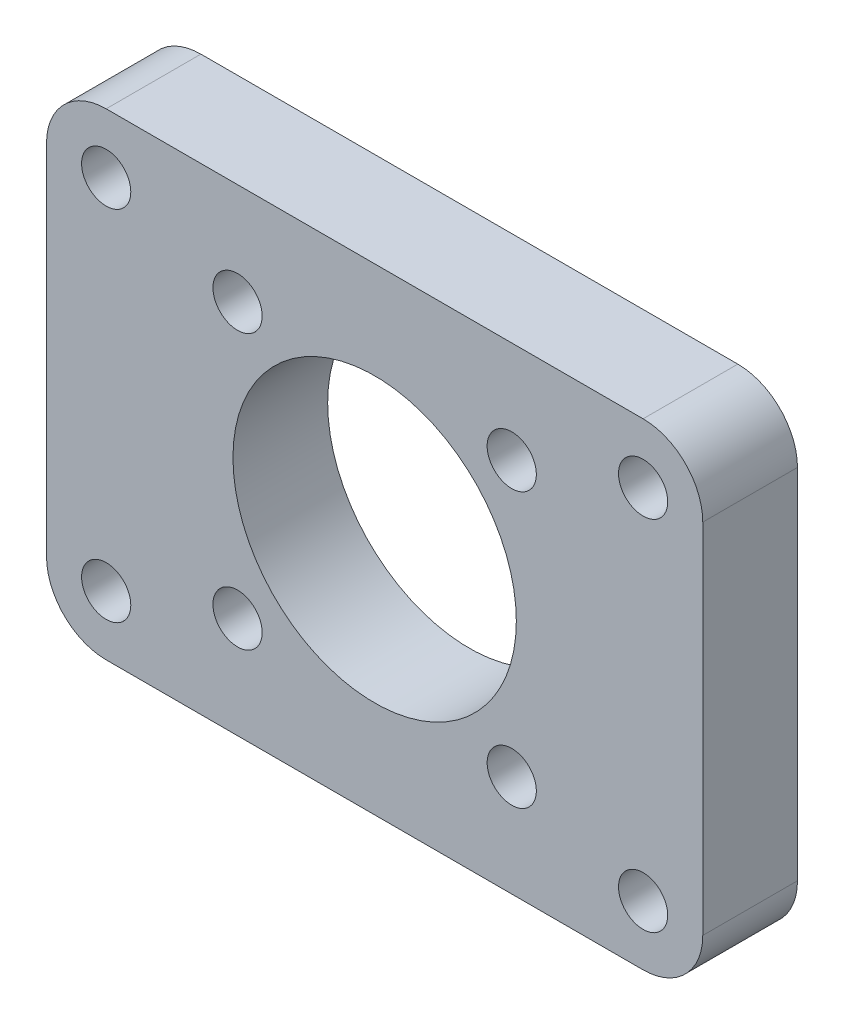
ISO-10303-21;
HEADER;
FILE_DESCRIPTION(('STEP AP214'),'2;1');
FILE_NAME('part.step','',(''),(''),'','','');
FILE_SCHEMA(('AUTOMOTIVE_DESIGN { 1 0 10303 214 1 1 1 1 }'));
ENDSEC;
DATA;
#1=APPLICATION_CONTEXT('core data for automotive mechanical design processes');
#2=APPLICATION_PROTOCOL_DEFINITION('international standard','automotive_design',2000,#1);
#3=PRODUCT_CONTEXT('',#1,'mechanical');
#4=PRODUCT('Part','Part','',(#3));
#5=PRODUCT_RELATED_PRODUCT_CATEGORY('part','',(#4));
#6=PRODUCT_DEFINITION_FORMATION('','',#4);
#7=PRODUCT_DEFINITION_CONTEXT('part definition',#1,'design');
#8=PRODUCT_DEFINITION('design','',#6,#7);
#9=PRODUCT_DEFINITION_SHAPE('','',#8);
#10=(LENGTH_UNIT() NAMED_UNIT(*) SI_UNIT(.MILLI.,.METRE.));
#11=(NAMED_UNIT(*) PLANE_ANGLE_UNIT() SI_UNIT($,.RADIAN.));
#12=(NAMED_UNIT(*) SI_UNIT($,.STERADIAN.) SOLID_ANGLE_UNIT());
#13=UNCERTAINTY_MEASURE_WITH_UNIT(LENGTH_MEASURE(1.E-05),#10,'distance_accuracy_value','');
#14=(GEOMETRIC_REPRESENTATION_CONTEXT(3) GLOBAL_UNCERTAINTY_ASSIGNED_CONTEXT((#13)) GLOBAL_UNIT_ASSIGNED_CONTEXT((#10,
#11,#12)) REPRESENTATION_CONTEXT('',''));
#15=CARTESIAN_POINT('',(0.,0.,0.));
#16=DIRECTION('',(0.,0.,1.));
#17=DIRECTION('',(1.,0.,0.));
#18=AXIS2_PLACEMENT_3D('',#15,#16,#17);
#19=CARTESIAN_POINT('',(0.,0.,6.35));
#20=DIRECTION('',(0.,0.,1.));
#21=DIRECTION('',(1.,0.,0.));
#22=AXIS2_PLACEMENT_3D('',#19,#20,#21);
#23=PLANE('',#22);
#24=CARTESIAN_POINT('',(18.,-12.,6.35));
#25=DIRECTION('',(0.,0.,1.));
#26=DIRECTION('',(1.,0.,0.));
#27=AXIS2_PLACEMENT_3D('',#24,#25,#26);
#28=CIRCLE('',#27,1.65);
#29=CARTESIAN_POINT('',(19.65,-12.,6.35));
#30=VERTEX_POINT('',#29);
#31=EDGE_CURVE('E227',#30,#30,#28,.T.);
#32=ORIENTED_EDGE('',*,*,#31,.F.);
#33=EDGE_LOOP('',(#32));
#34=FACE_BOUND('',#33,.T.);
#35=CARTESIAN_POINT('',(18.,12.,6.35));
#36=DIRECTION('',(0.,0.,1.));
#37=DIRECTION('',(1.,0.,0.));
#38=AXIS2_PLACEMENT_3D('',#35,#36,#37);
#39=CIRCLE('',#38,1.65);
#40=CARTESIAN_POINT('',(19.65,12.,6.35));
#41=VERTEX_POINT('',#40);
#42=EDGE_CURVE('E221',#41,#41,#39,.T.);
#43=ORIENTED_EDGE('',*,*,#42,.F.);
#44=EDGE_LOOP('',(#43));
#45=FACE_BOUND('',#44,.T.);
#46=CARTESIAN_POINT('',(-18.,-12.,6.35));
#47=DIRECTION('',(0.,0.,1.));
#48=DIRECTION('',(1.,0.,0.));
#49=AXIS2_PLACEMENT_3D('',#46,#47,#48);
#50=CIRCLE('',#49,1.65);
#51=CARTESIAN_POINT('',(-16.35,-12.,6.35));
#52=VERTEX_POINT('',#51);
#53=EDGE_CURVE('E215',#52,#52,#50,.T.);
#54=ORIENTED_EDGE('',*,*,#53,.F.);
#55=EDGE_LOOP('',(#54));
#56=FACE_BOUND('',#55,.T.);
#57=CARTESIAN_POINT('',(-18.,12.,6.35));
#58=DIRECTION('',(0.,0.,1.));
#59=DIRECTION('',(1.,0.,0.));
#60=AXIS2_PLACEMENT_3D('',#57,#58,#59);
#61=CIRCLE('',#60,1.65);
#62=CARTESIAN_POINT('',(-16.35,12.,6.35));
#63=VERTEX_POINT('',#62);
#64=EDGE_CURVE('E209',#63,#63,#61,.T.);
#65=ORIENTED_EDGE('',*,*,#64,.F.);
#66=EDGE_LOOP('',(#65));
#67=FACE_BOUND('',#66,.T.);
#68=CARTESIAN_POINT('',(9.19238815542512,-9.19238815542511,6.35));
#69=DIRECTION('',(0.,0.,1.));
#70=DIRECTION('',(1.,0.,0.));
#71=AXIS2_PLACEMENT_3D('',#68,#69,#70);
#72=CIRCLE('',#71,1.65);
#73=CARTESIAN_POINT('',(10.8423881554251,-9.19238815542511,6.35));
#74=VERTEX_POINT('',#73);
#75=EDGE_CURVE('E194',#74,#74,#72,.T.);
#76=ORIENTED_EDGE('',*,*,#75,.F.);
#77=EDGE_LOOP('',(#76));
#78=FACE_BOUND('',#77,.T.);
#79=CARTESIAN_POINT('',(-9.19238815542512,9.19238815542512,6.35));
#80=DIRECTION('',(0.,0.,1.));
#81=DIRECTION('',(1.,0.,0.));
#82=AXIS2_PLACEMENT_3D('',#79,#80,#81);
#83=CIRCLE('',#82,1.65);
#84=CARTESIAN_POINT('',(-7.54238815542512,9.19238815542512,6.35));
#85=VERTEX_POINT('',#84);
#86=EDGE_CURVE('E183',#85,#85,#83,.T.);
#87=ORIENTED_EDGE('',*,*,#86,.F.);
#88=EDGE_LOOP('',(#87));
#89=FACE_BOUND('',#88,.T.);
#90=DIRECTION('',(1.,0.,0.));
#91=VECTOR('',#90,1.);
#92=CARTESIAN_POINT('',(-22.,-16.,6.35));
#93=LINE('',#92,#91);
#94=CARTESIAN_POINT('',(-18.,-16.,6.35));
#95=VERTEX_POINT('',#94);
#96=CARTESIAN_POINT('',(18.,-16.,6.35));
#97=VERTEX_POINT('',#96);
#98=EDGE_CURVE('E168',#95,#97,#93,.T.);
#99=ORIENTED_EDGE('',*,*,#98,.T.);
#100=CARTESIAN_POINT('',(18.,-12.,6.35));
#101=DIRECTION('',(0.,0.,1.));
#102=DIRECTION('',(1.,0.,0.));
#103=AXIS2_PLACEMENT_3D('',#100,#101,#102);
#104=CIRCLE('',#103,4.);
#105=CARTESIAN_POINT('',(22.,-12.,6.35));
#106=VERTEX_POINT('',#105);
#107=EDGE_CURVE('E148',#97,#106,#104,.T.);
#108=ORIENTED_EDGE('',*,*,#107,.T.);
#109=DIRECTION('',(0.,1.,0.));
#110=VECTOR('',#109,1.);
#111=CARTESIAN_POINT('',(22.,16.,6.35));
#112=LINE('',#111,#110);
#113=CARTESIAN_POINT('',(22.,12.,6.35));
#114=VERTEX_POINT('',#113);
#115=EDGE_CURVE('E118',#106,#114,#112,.T.);
#116=ORIENTED_EDGE('',*,*,#115,.T.);
#117=CARTESIAN_POINT('',(18.,12.,6.35));
#118=DIRECTION('',(0.,0.,1.));
#119=DIRECTION('',(1.,0.,0.));
#120=AXIS2_PLACEMENT_3D('',#117,#118,#119);
#121=CIRCLE('',#120,4.);
#122=CARTESIAN_POINT('',(18.,16.,6.35));
#123=VERTEX_POINT('',#122);
#124=EDGE_CURVE('E54',#114,#123,#121,.T.);
#125=ORIENTED_EDGE('',*,*,#124,.T.);
#126=DIRECTION('',(-1.,0.,0.));
#127=VECTOR('',#126,1.);
#128=CARTESIAN_POINT('',(-22.,16.,6.35));
#129=LINE('',#128,#127);
#130=CARTESIAN_POINT('',(-18.,16.,6.35));
#131=VERTEX_POINT('',#130);
#132=EDGE_CURVE('E135',#123,#131,#129,.T.);
#133=ORIENTED_EDGE('',*,*,#132,.T.);
#134=CARTESIAN_POINT('',(-18.,12.,6.35));
#135=DIRECTION('',(0.,0.,1.));
#136=DIRECTION('',(1.,0.,0.));
#137=AXIS2_PLACEMENT_3D('',#134,#135,#136);
#138=CIRCLE('',#137,4.);
#139=CARTESIAN_POINT('',(-22.,12.,6.35));
#140=VERTEX_POINT('',#139);
#141=EDGE_CURVE('E143',#131,#140,#138,.T.);
#142=ORIENTED_EDGE('',*,*,#141,.T.);
#143=DIRECTION('',(0.,-1.,0.));
#144=VECTOR('',#143,1.);
#145=CARTESIAN_POINT('',(-22.,16.,6.35));
#146=LINE('',#145,#144);
#147=CARTESIAN_POINT('',(-22.,-12.,6.35));
#148=VERTEX_POINT('',#147);
#149=EDGE_CURVE('E129',#140,#148,#146,.T.);
#150=ORIENTED_EDGE('',*,*,#149,.T.);
#151=CARTESIAN_POINT('',(-18.,-12.,6.35));
#152=DIRECTION('',(0.,0.,1.));
#153=DIRECTION('',(1.,0.,0.));
#154=AXIS2_PLACEMENT_3D('',#151,#152,#153);
#155=CIRCLE('',#154,4.);
#156=EDGE_CURVE('E146',#148,#95,#155,.T.);
#157=ORIENTED_EDGE('',*,*,#156,.T.);
#158=EDGE_LOOP('',(#99,#108,#116,#125,#133,#142,#150,#157));
#159=FACE_BOUND('',#158,.T.);
#160=CARTESIAN_POINT('',(0.,0.,6.35));
#161=DIRECTION('',(0.,0.,1.));
#162=DIRECTION('',(1.,0.,0.));
#163=AXIS2_PLACEMENT_3D('',#160,#161,#162);
#164=CIRCLE('',#163,9.5);
#165=CARTESIAN_POINT('',(9.5,0.,6.35));
#166=VERTEX_POINT('',#165);
#167=EDGE_CURVE('E174',#166,#166,#164,.T.);
#168=ORIENTED_EDGE('',*,*,#167,.F.);
#169=EDGE_LOOP('',(#168));
#170=FACE_BOUND('',#169,.T.);
#171=CARTESIAN_POINT('',(9.19238815542512,9.19238815542512,6.35));
#172=DIRECTION('',(0.,0.,1.));
#173=DIRECTION('',(1.,0.,0.));
#174=AXIS2_PLACEMENT_3D('',#171,#172,#173);
#175=CIRCLE('',#174,1.65);
#176=CARTESIAN_POINT('',(10.8423881554251,9.19238815542512,6.35));
#177=VERTEX_POINT('',#176);
#178=EDGE_CURVE('E188',#177,#177,#175,.T.);
#179=ORIENTED_EDGE('',*,*,#178,.F.);
#180=EDGE_LOOP('',(#179));
#181=FACE_BOUND('',#180,.T.);
#182=CARTESIAN_POINT('',(-9.19238815542511,-9.19238815542512,6.35));
#183=DIRECTION('',(0.,0.,1.));
#184=DIRECTION('',(1.,0.,0.));
#185=AXIS2_PLACEMENT_3D('',#182,#183,#184);
#186=CIRCLE('',#185,1.65);
#187=CARTESIAN_POINT('',(-7.54238815542511,-9.19238815542512,6.35));
#188=VERTEX_POINT('',#187);
#189=EDGE_CURVE('E200',#188,#188,#186,.T.);
#190=ORIENTED_EDGE('',*,*,#189,.F.);
#191=EDGE_LOOP('',(#190));
#192=FACE_BOUND('',#191,.T.);
#193=ADVANCED_FACE('F33',(#34,#45,#56,#67,#78,#89,#159,#170,#181,#192),#23,.T.);
#194=CARTESIAN_POINT('',(0.,0.,0.));
#195=DIRECTION('',(0.,0.,1.));
#196=DIRECTION('',(1.,0.,0.));
#197=AXIS2_PLACEMENT_3D('',#194,#195,#196);
#198=PLANE('',#197);
#199=CARTESIAN_POINT('',(18.,-12.,0.));
#200=DIRECTION('',(0.,0.,1.));
#201=DIRECTION('',(1.,0.,0.));
#202=AXIS2_PLACEMENT_3D('',#199,#200,#201);
#203=CIRCLE('',#202,1.65);
#204=CARTESIAN_POINT('',(19.65,-12.,0.));
#205=VERTEX_POINT('',#204);
#206=EDGE_CURVE('E224',#205,#205,#203,.T.);
#207=ORIENTED_EDGE('',*,*,#206,.T.);
#208=EDGE_LOOP('',(#207));
#209=FACE_BOUND('',#208,.T.);
#210=CARTESIAN_POINT('',(18.,12.,0.));
#211=DIRECTION('',(0.,0.,1.));
#212=DIRECTION('',(1.,0.,0.));
#213=AXIS2_PLACEMENT_3D('',#210,#211,#212);
#214=CIRCLE('',#213,1.65);
#215=CARTESIAN_POINT('',(19.65,12.,0.));
#216=VERTEX_POINT('',#215);
#217=EDGE_CURVE('E218',#216,#216,#214,.T.);
#218=ORIENTED_EDGE('',*,*,#217,.T.);
#219=EDGE_LOOP('',(#218));
#220=FACE_BOUND('',#219,.T.);
#221=CARTESIAN_POINT('',(-18.,-12.,0.));
#222=DIRECTION('',(0.,0.,1.));
#223=DIRECTION('',(1.,0.,0.));
#224=AXIS2_PLACEMENT_3D('',#221,#222,#223);
#225=CIRCLE('',#224,1.65);
#226=CARTESIAN_POINT('',(-16.35,-12.,0.));
#227=VERTEX_POINT('',#226);
#228=EDGE_CURVE('E212',#227,#227,#225,.T.);
#229=ORIENTED_EDGE('',*,*,#228,.T.);
#230=EDGE_LOOP('',(#229));
#231=FACE_BOUND('',#230,.T.);
#232=CARTESIAN_POINT('',(-18.,12.,0.));
#233=DIRECTION('',(0.,0.,1.));
#234=DIRECTION('',(1.,0.,0.));
#235=AXIS2_PLACEMENT_3D('',#232,#233,#234);
#236=CIRCLE('',#235,1.65);
#237=CARTESIAN_POINT('',(-16.35,12.,0.));
#238=VERTEX_POINT('',#237);
#239=EDGE_CURVE('E206',#238,#238,#236,.T.);
#240=ORIENTED_EDGE('',*,*,#239,.T.);
#241=EDGE_LOOP('',(#240));
#242=FACE_BOUND('',#241,.T.);
#243=CARTESIAN_POINT('',(9.19238815542512,-9.19238815542511,0.));
#244=DIRECTION('',(0.,0.,1.));
#245=DIRECTION('',(1.,0.,0.));
#246=AXIS2_PLACEMENT_3D('',#243,#244,#245);
#247=CIRCLE('',#246,1.65);
#248=CARTESIAN_POINT('',(10.8423881554251,-9.19238815542511,0.));
#249=VERTEX_POINT('',#248);
#250=EDGE_CURVE('E197',#249,#249,#247,.T.);
#251=ORIENTED_EDGE('',*,*,#250,.T.);
#252=EDGE_LOOP('',(#251));
#253=FACE_BOUND('',#252,.T.);
#254=CARTESIAN_POINT('',(-9.19238815542512,9.19238815542512,0.));
#255=DIRECTION('',(0.,0.,1.));
#256=DIRECTION('',(1.,0.,0.));
#257=AXIS2_PLACEMENT_3D('',#254,#255,#256);
#258=CIRCLE('',#257,1.65);
#259=CARTESIAN_POINT('',(-7.54238815542512,9.19238815542512,0.));
#260=VERTEX_POINT('',#259);
#261=EDGE_CURVE('E185',#260,#260,#258,.T.);
#262=ORIENTED_EDGE('',*,*,#261,.T.);
#263=EDGE_LOOP('',(#262));
#264=FACE_BOUND('',#263,.T.);
#265=DIRECTION('',(0.,1.,0.));
#266=VECTOR('',#265,1.);
#267=CARTESIAN_POINT('',(22.,16.,0.));
#268=LINE('',#267,#266);
#269=CARTESIAN_POINT('',(22.,-12.,0.));
#270=VERTEX_POINT('',#269);
#271=CARTESIAN_POINT('',(22.,12.,0.));
#272=VERTEX_POINT('',#271);
#273=EDGE_CURVE('E116',#270,#272,#268,.T.);
#274=ORIENTED_EDGE('',*,*,#273,.F.);
#275=CARTESIAN_POINT('',(18.,-12.,0.));
#276=DIRECTION('',(0.,0.,1.));
#277=DIRECTION('',(1.,0.,0.));
#278=AXIS2_PLACEMENT_3D('',#275,#276,#277);
#279=CIRCLE('',#278,4.);
#280=CARTESIAN_POINT('',(18.,-16.,0.));
#281=VERTEX_POINT('',#280);
#282=EDGE_CURVE('E99',#270,#281,#279,.F.);
#283=ORIENTED_EDGE('',*,*,#282,.T.);
#284=DIRECTION('',(1.,0.,0.));
#285=VECTOR('',#284,1.);
#286=CARTESIAN_POINT('',(-22.,-16.,0.));
#287=LINE('',#286,#285);
#288=CARTESIAN_POINT('',(-18.,-16.,0.));
#289=VERTEX_POINT('',#288);
#290=EDGE_CURVE('E127',#289,#281,#287,.T.);
#291=ORIENTED_EDGE('',*,*,#290,.F.);
#292=CARTESIAN_POINT('',(-18.,-12.,0.));
#293=DIRECTION('',(0.,0.,1.));
#294=DIRECTION('',(1.,0.,0.));
#295=AXIS2_PLACEMENT_3D('',#292,#293,#294);
#296=CIRCLE('',#295,4.);
#297=CARTESIAN_POINT('',(-22.,-12.,0.));
#298=VERTEX_POINT('',#297);
#299=EDGE_CURVE('E110',#289,#298,#296,.F.);
#300=ORIENTED_EDGE('',*,*,#299,.T.);
#301=DIRECTION('',(0.,-1.,0.));
#302=VECTOR('',#301,1.);
#303=CARTESIAN_POINT('',(-22.,16.,0.));
#304=LINE('',#303,#302);
#305=CARTESIAN_POINT('',(-22.,12.,0.));
#306=VERTEX_POINT('',#305);
#307=EDGE_CURVE('E131',#306,#298,#304,.T.);
#308=ORIENTED_EDGE('',*,*,#307,.F.);
#309=CARTESIAN_POINT('',(-18.,12.,0.));
#310=DIRECTION('',(0.,0.,1.));
#311=DIRECTION('',(1.,0.,0.));
#312=AXIS2_PLACEMENT_3D('',#309,#310,#311);
#313=CIRCLE('',#312,4.);
#314=CARTESIAN_POINT('',(-18.,16.,0.));
#315=VERTEX_POINT('',#314);
#316=EDGE_CURVE('E119',#306,#315,#313,.F.);
#317=ORIENTED_EDGE('',*,*,#316,.T.);
#318=DIRECTION('',(-1.,0.,0.));
#319=VECTOR('',#318,1.);
#320=CARTESIAN_POINT('',(-22.,16.,0.));
#321=LINE('',#320,#319);
#322=CARTESIAN_POINT('',(18.,16.,0.));
#323=VERTEX_POINT('',#322);
#324=EDGE_CURVE('E126',#323,#315,#321,.T.);
#325=ORIENTED_EDGE('',*,*,#324,.F.);
#326=CARTESIAN_POINT('',(18.,12.,0.));
#327=DIRECTION('',(0.,0.,1.));
#328=DIRECTION('',(1.,0.,0.));
#329=AXIS2_PLACEMENT_3D('',#326,#327,#328);
#330=CIRCLE('',#329,4.);
#331=EDGE_CURVE('E125',#323,#272,#330,.F.);
#332=ORIENTED_EDGE('',*,*,#331,.T.);
#333=EDGE_LOOP('',(#274,#283,#291,#300,#308,#317,#325,#332));
#334=FACE_BOUND('',#333,.T.);
#335=CARTESIAN_POINT('',(0.,0.,0.));
#336=DIRECTION('',(0.,0.,1.));
#337=DIRECTION('',(1.,0.,0.));
#338=AXIS2_PLACEMENT_3D('',#335,#336,#337);
#339=CIRCLE('',#338,9.5);
#340=CARTESIAN_POINT('',(9.5,0.,0.));
#341=VERTEX_POINT('',#340);
#342=EDGE_CURVE('E176',#341,#341,#339,.T.);
#343=ORIENTED_EDGE('',*,*,#342,.T.);
#344=EDGE_LOOP('',(#343));
#345=FACE_BOUND('',#344,.T.);
#346=CARTESIAN_POINT('',(9.19238815542512,9.19238815542512,0.));
#347=DIRECTION('',(0.,0.,1.));
#348=DIRECTION('',(1.,0.,0.));
#349=AXIS2_PLACEMENT_3D('',#346,#347,#348);
#350=CIRCLE('',#349,1.65);
#351=CARTESIAN_POINT('',(10.8423881554251,9.19238815542512,0.));
#352=VERTEX_POINT('',#351);
#353=EDGE_CURVE('E191',#352,#352,#350,.T.);
#354=ORIENTED_EDGE('',*,*,#353,.T.);
#355=EDGE_LOOP('',(#354));
#356=FACE_BOUND('',#355,.T.);
#357=CARTESIAN_POINT('',(-9.19238815542511,-9.19238815542512,0.));
#358=DIRECTION('',(0.,0.,1.));
#359=DIRECTION('',(1.,0.,0.));
#360=AXIS2_PLACEMENT_3D('',#357,#358,#359);
#361=CIRCLE('',#360,1.65);
#362=CARTESIAN_POINT('',(-7.54238815542511,-9.19238815542512,0.));
#363=VERTEX_POINT('',#362);
#364=EDGE_CURVE('E203',#363,#363,#361,.T.);
#365=ORIENTED_EDGE('',*,*,#364,.T.);
#366=EDGE_LOOP('',(#365));
#367=FACE_BOUND('',#366,.T.);
#368=ADVANCED_FACE('F122',(#209,#220,#231,#242,#253,#264,#334,#345,#356,#367),#198,.F.);
#369=CARTESIAN_POINT('',(-22.,16.,6.35));
#370=DIRECTION('',(1.,0.,0.));
#371=DIRECTION('',(0.,1.,0.));
#372=AXIS2_PLACEMENT_3D('',#369,#370,#371);
#373=PLANE('',#372);
#374=ORIENTED_EDGE('',*,*,#307,.T.);
#375=DIRECTION('',(0.,0.,-1.));
#376=VECTOR('',#375,1.);
#377=CARTESIAN_POINT('',(-22.,-12.,6.35));
#378=LINE('',#377,#376);
#379=EDGE_CURVE('E153',#298,#148,#378,.F.);
#380=ORIENTED_EDGE('',*,*,#379,.T.);
#381=ORIENTED_EDGE('',*,*,#149,.F.);
#382=DIRECTION('',(0.,0.,-1.));
#383=VECTOR('',#382,1.);
#384=CARTESIAN_POINT('',(-22.,12.,6.35));
#385=LINE('',#384,#383);
#386=EDGE_CURVE('E150',#140,#306,#385,.T.);
#387=ORIENTED_EDGE('',*,*,#386,.T.);
#388=EDGE_LOOP('',(#374,#380,#381,#387));
#389=FACE_BOUND('',#388,.T.);
#390=ADVANCED_FACE('F159',(#389),#373,.F.);
#391=CARTESIAN_POINT('',(-22.,-16.,6.35));
#392=DIRECTION('',(0.,1.,0.));
#393=DIRECTION('',(0.,0.,1.));
#394=AXIS2_PLACEMENT_3D('',#391,#392,#393);
#395=PLANE('',#394);
#396=ORIENTED_EDGE('',*,*,#290,.T.);
#397=DIRECTION('',(0.,0.,-1.));
#398=VECTOR('',#397,1.);
#399=CARTESIAN_POINT('',(18.,-16.,6.35));
#400=LINE('',#399,#398);
#401=EDGE_CURVE('E104',#281,#97,#400,.F.);
#402=ORIENTED_EDGE('',*,*,#401,.T.);
#403=ORIENTED_EDGE('',*,*,#98,.F.);
#404=DIRECTION('',(0.,0.,-1.));
#405=VECTOR('',#404,1.);
#406=CARTESIAN_POINT('',(-18.,-16.,6.35));
#407=LINE('',#406,#405);
#408=EDGE_CURVE('E109',#95,#289,#407,.T.);
#409=ORIENTED_EDGE('',*,*,#408,.T.);
#410=EDGE_LOOP('',(#396,#402,#403,#409));
#411=FACE_BOUND('',#410,.T.);
#412=ADVANCED_FACE('F173',(#411),#395,.F.);
#413=CARTESIAN_POINT('',(22.,16.,6.35));
#414=DIRECTION('',(-1.,0.,0.));
#415=DIRECTION('',(0.,-1.,0.));
#416=AXIS2_PLACEMENT_3D('',#413,#414,#415);
#417=PLANE('',#416);
#418=ORIENTED_EDGE('',*,*,#115,.F.);
#419=DIRECTION('',(0.,0.,-1.));
#420=VECTOR('',#419,1.);
#421=CARTESIAN_POINT('',(22.,-12.,6.35));
#422=LINE('',#421,#420);
#423=EDGE_CURVE('E103',#106,#270,#422,.T.);
#424=ORIENTED_EDGE('',*,*,#423,.T.);
#425=ORIENTED_EDGE('',*,*,#273,.T.);
#426=DIRECTION('',(0.,0.,-1.));
#427=VECTOR('',#426,1.);
#428=CARTESIAN_POINT('',(22.,12.,6.35));
#429=LINE('',#428,#427);
#430=EDGE_CURVE('E120',#272,#114,#429,.F.);
#431=ORIENTED_EDGE('',*,*,#430,.T.);
#432=EDGE_LOOP('',(#418,#424,#425,#431));
#433=FACE_BOUND('',#432,.T.);
#434=ADVANCED_FACE('F115',(#433),#417,.F.);
#435=CARTESIAN_POINT('',(-22.,16.,6.35));
#436=DIRECTION('',(0.,-1.,0.));
#437=DIRECTION('',(1.,0.,0.));
#438=AXIS2_PLACEMENT_3D('',#435,#436,#437);
#439=PLANE('',#438);
#440=ORIENTED_EDGE('',*,*,#132,.F.);
#441=DIRECTION('',(0.,0.,-1.));
#442=VECTOR('',#441,1.);
#443=CARTESIAN_POINT('',(18.,16.,6.35));
#444=LINE('',#443,#442);
#445=EDGE_CURVE('E11',#123,#323,#444,.T.);
#446=ORIENTED_EDGE('',*,*,#445,.T.);
#447=ORIENTED_EDGE('',*,*,#324,.T.);
#448=DIRECTION('',(0.,0.,-1.));
#449=VECTOR('',#448,1.);
#450=CARTESIAN_POINT('',(-18.,16.,6.35));
#451=LINE('',#450,#449);
#452=EDGE_CURVE('E41',#315,#131,#451,.F.);
#453=ORIENTED_EDGE('',*,*,#452,.T.);
#454=EDGE_LOOP('',(#440,#446,#447,#453));
#455=FACE_BOUND('',#454,.T.);
#456=ADVANCED_FACE('F271',(#455),#439,.F.);
#457=CARTESIAN_POINT('',(0.,0.,6.35));
#458=DIRECTION('',(0.,0.,-1.));
#459=DIRECTION('',(-1.,0.,0.));
#460=AXIS2_PLACEMENT_3D('',#457,#458,#459);
#461=CYLINDRICAL_SURFACE('',#460,9.5);
#462=ORIENTED_EDGE('',*,*,#167,.T.);
#463=EDGE_LOOP('',(#462));
#464=FACE_BOUND('',#463,.T.);
#465=ORIENTED_EDGE('',*,*,#342,.F.);
#466=EDGE_LOOP('',(#465));
#467=FACE_BOUND('',#466,.T.);
#468=ADVANCED_FACE('F259',(#464,#467),#461,.F.);
#469=CARTESIAN_POINT('',(-9.19238815542512,9.19238815542512,6.35));
#470=DIRECTION('',(0.,0.,-1.));
#471=DIRECTION('',(-1.,0.,0.));
#472=AXIS2_PLACEMENT_3D('',#469,#470,#471);
#473=CYLINDRICAL_SURFACE('',#472,1.65);
#474=ORIENTED_EDGE('',*,*,#86,.T.);
#475=EDGE_LOOP('',(#474));
#476=FACE_BOUND('',#475,.T.);
#477=ORIENTED_EDGE('',*,*,#261,.F.);
#478=EDGE_LOOP('',(#477));
#479=FACE_BOUND('',#478,.T.);
#480=ADVANCED_FACE('F255',(#476,#479),#473,.F.);
#481=CARTESIAN_POINT('',(9.19238815542512,9.19238815542512,6.35));
#482=DIRECTION('',(0.,0.,-1.));
#483=DIRECTION('',(-1.,0.,0.));
#484=AXIS2_PLACEMENT_3D('',#481,#482,#483);
#485=CYLINDRICAL_SURFACE('',#484,1.65);
#486=ORIENTED_EDGE('',*,*,#178,.T.);
#487=EDGE_LOOP('',(#486));
#488=FACE_BOUND('',#487,.T.);
#489=ORIENTED_EDGE('',*,*,#353,.F.);
#490=EDGE_LOOP('',(#489));
#491=FACE_BOUND('',#490,.T.);
#492=ADVANCED_FACE('F258',(#488,#491),#485,.F.);
#493=CARTESIAN_POINT('',(9.19238815542512,-9.19238815542511,6.35));
#494=DIRECTION('',(0.,0.,-1.));
#495=DIRECTION('',(-1.,0.,0.));
#496=AXIS2_PLACEMENT_3D('',#493,#494,#495);
#497=CYLINDRICAL_SURFACE('',#496,1.65);
#498=ORIENTED_EDGE('',*,*,#75,.T.);
#499=EDGE_LOOP('',(#498));
#500=FACE_BOUND('',#499,.T.);
#501=ORIENTED_EDGE('',*,*,#250,.F.);
#502=EDGE_LOOP('',(#501));
#503=FACE_BOUND('',#502,.T.);
#504=ADVANCED_FACE('F388',(#500,#503),#497,.F.);
#505=CARTESIAN_POINT('',(-9.19238815542511,-9.19238815542512,6.35));
#506=DIRECTION('',(0.,0.,-1.));
#507=DIRECTION('',(-1.,0.,0.));
#508=AXIS2_PLACEMENT_3D('',#505,#506,#507);
#509=CYLINDRICAL_SURFACE('',#508,1.65);
#510=ORIENTED_EDGE('',*,*,#189,.T.);
#511=EDGE_LOOP('',(#510));
#512=FACE_BOUND('',#511,.T.);
#513=ORIENTED_EDGE('',*,*,#364,.F.);
#514=EDGE_LOOP('',(#513));
#515=FACE_BOUND('',#514,.T.);
#516=ADVANCED_FACE('F378',(#512,#515),#509,.F.);
#517=CARTESIAN_POINT('',(-18.,12.,0.));
#518=DIRECTION('',(0.,0.,1.));
#519=DIRECTION('',(1.,0.,0.));
#520=AXIS2_PLACEMENT_3D('',#517,#518,#519);
#521=CYLINDRICAL_SURFACE('',#520,1.65);
#522=ORIENTED_EDGE('',*,*,#239,.F.);
#523=EDGE_LOOP('',(#522));
#524=FACE_BOUND('',#523,.T.);
#525=ORIENTED_EDGE('',*,*,#64,.T.);
#526=EDGE_LOOP('',(#525));
#527=FACE_BOUND('',#526,.T.);
#528=ADVANCED_FACE('F368',(#524,#527),#521,.F.);
#529=CARTESIAN_POINT('',(-18.,-12.,0.));
#530=DIRECTION('',(0.,0.,1.));
#531=DIRECTION('',(1.,0.,0.));
#532=AXIS2_PLACEMENT_3D('',#529,#530,#531);
#533=CYLINDRICAL_SURFACE('',#532,1.65);
#534=ORIENTED_EDGE('',*,*,#228,.F.);
#535=EDGE_LOOP('',(#534));
#536=FACE_BOUND('',#535,.T.);
#537=ORIENTED_EDGE('',*,*,#53,.T.);
#538=EDGE_LOOP('',(#537));
#539=FACE_BOUND('',#538,.T.);
#540=ADVANCED_FACE('F358',(#536,#539),#533,.F.);
#541=CARTESIAN_POINT('',(18.,12.,0.));
#542=DIRECTION('',(0.,0.,1.));
#543=DIRECTION('',(1.,0.,0.));
#544=AXIS2_PLACEMENT_3D('',#541,#542,#543);
#545=CYLINDRICAL_SURFACE('',#544,1.65);
#546=ORIENTED_EDGE('',*,*,#217,.F.);
#547=EDGE_LOOP('',(#546));
#548=FACE_BOUND('',#547,.T.);
#549=ORIENTED_EDGE('',*,*,#42,.T.);
#550=EDGE_LOOP('',(#549));
#551=FACE_BOUND('',#550,.T.);
#552=ADVANCED_FACE('F238',(#548,#551),#545,.F.);
#553=CARTESIAN_POINT('',(18.,-12.,0.));
#554=DIRECTION('',(0.,0.,1.));
#555=DIRECTION('',(1.,0.,0.));
#556=AXIS2_PLACEMENT_3D('',#553,#554,#555);
#557=CYLINDRICAL_SURFACE('',#556,1.65);
#558=ORIENTED_EDGE('',*,*,#206,.F.);
#559=EDGE_LOOP('',(#558));
#560=FACE_BOUND('',#559,.T.);
#561=ORIENTED_EDGE('',*,*,#31,.T.);
#562=EDGE_LOOP('',(#561));
#563=FACE_BOUND('',#562,.T.);
#564=ADVANCED_FACE('F235',(#560,#563),#557,.F.);
#565=CARTESIAN_POINT('',(18.,-12.,6.35));
#566=DIRECTION('',(0.,0.,-1.));
#567=DIRECTION('',(-1.,0.,0.));
#568=AXIS2_PLACEMENT_3D('',#565,#566,#567);
#569=CYLINDRICAL_SURFACE('',#568,4.);
#570=ORIENTED_EDGE('',*,*,#107,.F.);
#571=ORIENTED_EDGE('',*,*,#401,.F.);
#572=ORIENTED_EDGE('',*,*,#282,.F.);
#573=ORIENTED_EDGE('',*,*,#423,.F.);
#574=EDGE_LOOP('',(#570,#571,#572,#573));
#575=FACE_BOUND('',#574,.T.);
#576=ADVANCED_FACE('F102',(#575),#569,.T.);
#577=CARTESIAN_POINT('',(-18.,-12.,6.35));
#578=DIRECTION('',(0.,0.,-1.));
#579=DIRECTION('',(-1.,0.,0.));
#580=AXIS2_PLACEMENT_3D('',#577,#578,#579);
#581=CYLINDRICAL_SURFACE('',#580,4.);
#582=ORIENTED_EDGE('',*,*,#156,.F.);
#583=ORIENTED_EDGE('',*,*,#379,.F.);
#584=ORIENTED_EDGE('',*,*,#299,.F.);
#585=ORIENTED_EDGE('',*,*,#408,.F.);
#586=EDGE_LOOP('',(#582,#583,#584,#585));
#587=FACE_BOUND('',#586,.T.);
#588=ADVANCED_FACE('F171',(#587),#581,.T.);
#589=CARTESIAN_POINT('',(18.,12.,6.35));
#590=DIRECTION('',(0.,0.,-1.));
#591=DIRECTION('',(-1.,0.,0.));
#592=AXIS2_PLACEMENT_3D('',#589,#590,#591);
#593=CYLINDRICAL_SURFACE('',#592,4.);
#594=ORIENTED_EDGE('',*,*,#124,.F.);
#595=ORIENTED_EDGE('',*,*,#430,.F.);
#596=ORIENTED_EDGE('',*,*,#331,.F.);
#597=ORIENTED_EDGE('',*,*,#445,.F.);
#598=EDGE_LOOP('',(#594,#595,#596,#597));
#599=FACE_BOUND('',#598,.T.);
#600=ADVANCED_FACE('F281',(#599),#593,.T.);
#601=CARTESIAN_POINT('',(-18.,12.,6.35));
#602=DIRECTION('',(0.,0.,-1.));
#603=DIRECTION('',(-1.,0.,0.));
#604=AXIS2_PLACEMENT_3D('',#601,#602,#603);
#605=CYLINDRICAL_SURFACE('',#604,4.);
#606=ORIENTED_EDGE('',*,*,#141,.F.);
#607=ORIENTED_EDGE('',*,*,#452,.F.);
#608=ORIENTED_EDGE('',*,*,#316,.F.);
#609=ORIENTED_EDGE('',*,*,#386,.F.);
#610=EDGE_LOOP('',(#606,#607,#608,#609));
#611=FACE_BOUND('',#610,.T.);
#612=ADVANCED_FACE('F35',(#611),#605,.T.);
#613=CLOSED_SHELL('',(#193,#368,#390,#412,#434,#456,#468,#480,#492,#504,#516,#528,#540,#552,
#564,#576,#588,#600,#612));
#614=MANIFOLD_SOLID_BREP('B2',#613);
#615=ADVANCED_BREP_SHAPE_REPRESENTATION('',(#18,#614),#14);
#616=SHAPE_DEFINITION_REPRESENTATION(#9,#615);
ENDSEC;
END-ISO-10303-21;
